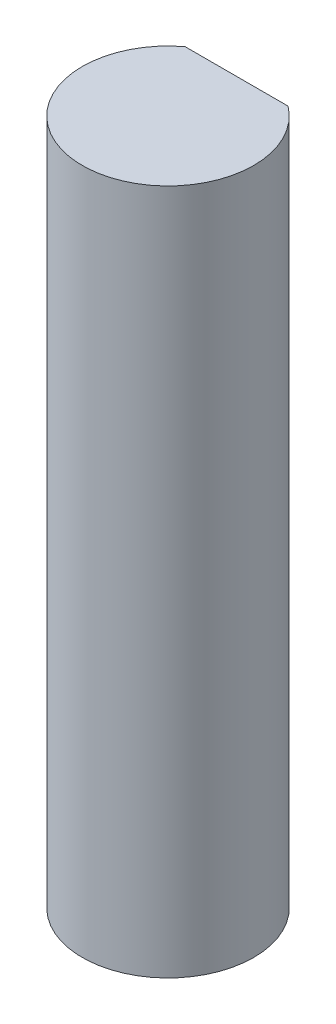
ISO-10303-21;
HEADER;
FILE_DESCRIPTION(('STEP AP214'),'2;1');
FILE_NAME('part.step','',(''),(''),'','','');
FILE_SCHEMA(('AUTOMOTIVE_DESIGN { 1 0 10303 214 1 1 1 1 }'));
ENDSEC;
DATA;
#1=APPLICATION_CONTEXT('core data for automotive mechanical design processes');
#2=APPLICATION_PROTOCOL_DEFINITION('international standard','automotive_design',2000,#1);
#3=PRODUCT_CONTEXT('',#1,'mechanical');
#4=PRODUCT('Part','Part','',(#3));
#5=PRODUCT_RELATED_PRODUCT_CATEGORY('part','',(#4));
#6=PRODUCT_DEFINITION_FORMATION('','',#4);
#7=PRODUCT_DEFINITION_CONTEXT('part definition',#1,'design');
#8=PRODUCT_DEFINITION('design','',#6,#7);
#9=PRODUCT_DEFINITION_SHAPE('','',#8);
#10=(LENGTH_UNIT() NAMED_UNIT(*) SI_UNIT(.MILLI.,.METRE.));
#11=(NAMED_UNIT(*) PLANE_ANGLE_UNIT() SI_UNIT($,.RADIAN.));
#12=(NAMED_UNIT(*) SI_UNIT($,.STERADIAN.) SOLID_ANGLE_UNIT());
#13=UNCERTAINTY_MEASURE_WITH_UNIT(LENGTH_MEASURE(1.E-05),#10,'distance_accuracy_value','');
#14=(GEOMETRIC_REPRESENTATION_CONTEXT(3) GLOBAL_UNCERTAINTY_ASSIGNED_CONTEXT((#13)) GLOBAL_UNIT_ASSIGNED_CONTEXT((#10,
#11,#12)) REPRESENTATION_CONTEXT('',''));
#15=CARTESIAN_POINT('',(0.,0.,0.));
#16=DIRECTION('',(0.,0.,1.));
#17=DIRECTION('',(1.,0.,0.));
#18=AXIS2_PLACEMENT_3D('',#15,#16,#17);
#19=CARTESIAN_POINT('',(0.,25.4,0.));
#20=DIRECTION('',(0.,-1.,0.));
#21=DIRECTION('',(0.,0.,-1.));
#22=AXIS2_PLACEMENT_3D('',#19,#20,#21);
#23=CYLINDRICAL_SURFACE('',#22,3.175);
#24=CARTESIAN_POINT('',(0.,25.4,0.));
#25=DIRECTION('',(0.,1.,0.));
#26=DIRECTION('',(0.,0.,1.));
#27=AXIS2_PLACEMENT_3D('',#24,#25,#26);
#28=CIRCLE('',#27,3.175);
#29=CARTESIAN_POINT('',(-1.905,25.4,-2.54));
#30=VERTEX_POINT('',#29);
#31=CARTESIAN_POINT('',(1.905,25.4,-2.54));
#32=VERTEX_POINT('',#31);
#33=EDGE_CURVE('E11',#30,#32,#28,.T.);
#34=ORIENTED_EDGE('',*,*,#33,.F.);
#35=DIRECTION('',(0.,-1.,0.));
#36=VECTOR('',#35,1.);
#37=CARTESIAN_POINT('',(-1.905,25.4,-2.54));
#38=LINE('',#37,#36);
#39=CARTESIAN_POINT('',(-1.905,0.,-2.54));
#40=VERTEX_POINT('',#39);
#41=EDGE_CURVE('E57',#30,#40,#38,.T.);
#42=ORIENTED_EDGE('',*,*,#41,.T.);
#43=CARTESIAN_POINT('',(0.,0.,0.));
#44=DIRECTION('',(0.,1.,0.));
#45=DIRECTION('',(0.,0.,1.));
#46=AXIS2_PLACEMENT_3D('',#43,#44,#45);
#47=CIRCLE('',#46,3.175);
#48=CARTESIAN_POINT('',(1.905,0.,-2.54));
#49=VERTEX_POINT('',#48);
#50=EDGE_CURVE('E40',#40,#49,#47,.T.);
#51=ORIENTED_EDGE('',*,*,#50,.T.);
#52=DIRECTION('',(0.,-1.,0.));
#53=VECTOR('',#52,1.);
#54=CARTESIAN_POINT('',(1.905,25.4,-2.54));
#55=LINE('',#54,#53);
#56=EDGE_CURVE('E51',#32,#49,#55,.T.);
#57=ORIENTED_EDGE('',*,*,#56,.F.);
#58=EDGE_LOOP('',(#34,#42,#51,#57));
#59=FACE_BOUND('',#58,.T.);
#60=ADVANCED_FACE('F37',(#59),#23,.T.);
#61=CARTESIAN_POINT('',(0.,25.4,0.));
#62=DIRECTION('',(0.,1.,0.));
#63=DIRECTION('',(0.,0.,1.));
#64=AXIS2_PLACEMENT_3D('',#61,#62,#63);
#65=PLANE('',#64);
#66=DIRECTION('',(-1.,0.,0.));
#67=VECTOR('',#66,1.);
#68=CARTESIAN_POINT('',(1.905,25.4,-2.54));
#69=LINE('',#68,#67);
#70=EDGE_CURVE('E66',#32,#30,#69,.T.);
#71=ORIENTED_EDGE('',*,*,#70,.T.);
#72=ORIENTED_EDGE('',*,*,#33,.T.);
#73=EDGE_LOOP('',(#71,#72));
#74=FACE_BOUND('',#73,.T.);
#75=ADVANCED_FACE('F73',(#74),#65,.T.);
#76=CARTESIAN_POINT('',(0.,0.,0.));
#77=DIRECTION('',(0.,1.,0.));
#78=DIRECTION('',(0.,0.,1.));
#79=AXIS2_PLACEMENT_3D('',#76,#77,#78);
#80=PLANE('',#79);
#81=ORIENTED_EDGE('',*,*,#50,.F.);
#82=DIRECTION('',(-1.,0.,0.));
#83=VECTOR('',#82,1.);
#84=CARTESIAN_POINT('',(1.905,0.,-2.54));
#85=LINE('',#84,#83);
#86=EDGE_CURVE('E61',#49,#40,#85,.T.);
#87=ORIENTED_EDGE('',*,*,#86,.F.);
#88=EDGE_LOOP('',(#81,#87));
#89=FACE_BOUND('',#88,.T.);
#90=ADVANCED_FACE('F71',(#89),#80,.F.);
#91=CARTESIAN_POINT('',(1.905,25.4,-2.54));
#92=DIRECTION('',(0.,0.,1.));
#93=DIRECTION('',(1.,0.,0.));
#94=AXIS2_PLACEMENT_3D('',#91,#92,#93);
#95=PLANE('',#94);
#96=ORIENTED_EDGE('',*,*,#86,.T.);
#97=ORIENTED_EDGE('',*,*,#41,.F.);
#98=ORIENTED_EDGE('',*,*,#70,.F.);
#99=ORIENTED_EDGE('',*,*,#56,.T.);
#100=EDGE_LOOP('',(#96,#97,#98,#99));
#101=FACE_BOUND('',#100,.T.);
#102=ADVANCED_FACE('F62',(#101),#95,.F.);
#103=CLOSED_SHELL('',(#60,#75,#90,#102));
#104=MANIFOLD_SOLID_BREP('B2',#103);
#105=ADVANCED_BREP_SHAPE_REPRESENTATION('',(#18,#104),#14);
#106=SHAPE_DEFINITION_REPRESENTATION(#9,#105);
ENDSEC;
END-ISO-10303-21;
